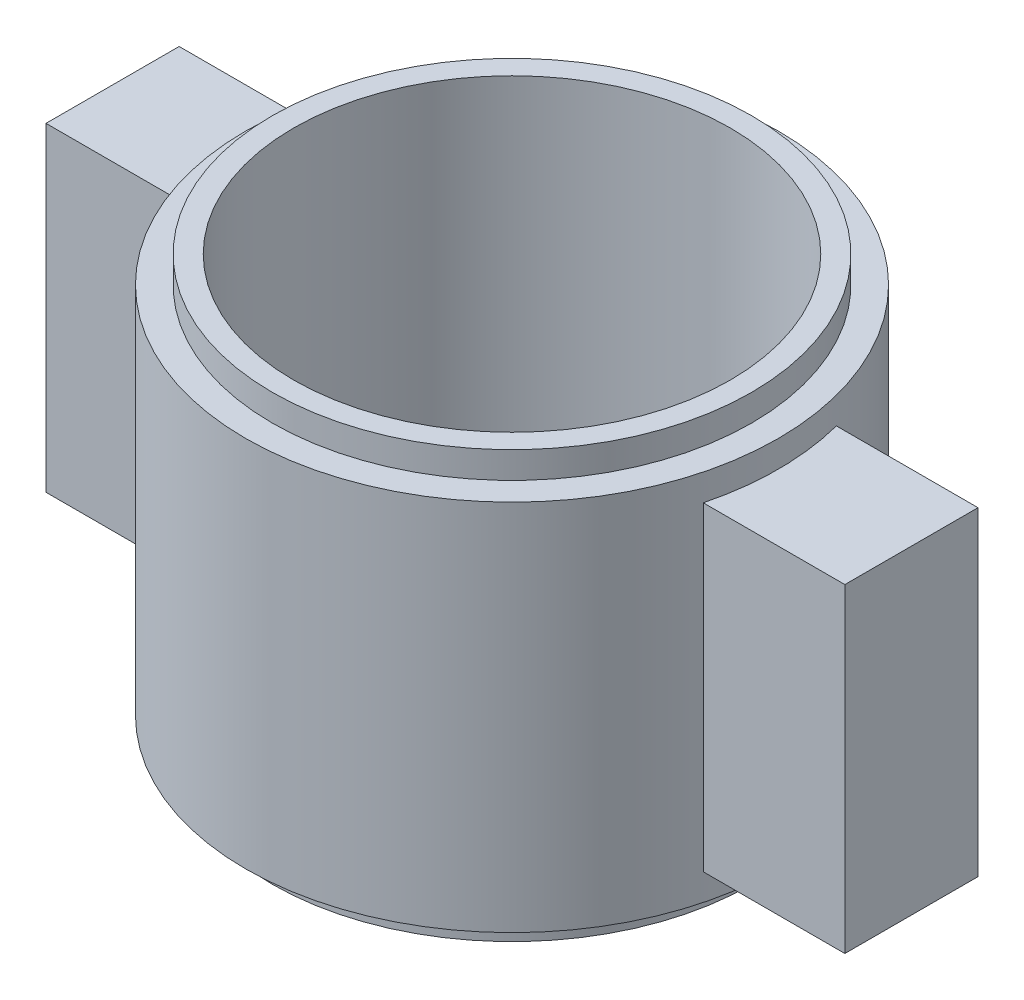
ISO-10303-21;
HEADER;
FILE_DESCRIPTION(('STEP AP214'),'2;1');
FILE_NAME('part.step','',(''),(''),'','','');
FILE_SCHEMA(('AUTOMOTIVE_DESIGN { 1 0 10303 214 1 1 1 1 }'));
ENDSEC;
DATA;
#1=APPLICATION_CONTEXT('core data for automotive mechanical design processes');
#2=APPLICATION_PROTOCOL_DEFINITION('international standard','automotive_design',2000,#1);
#3=PRODUCT_CONTEXT('',#1,'mechanical');
#4=PRODUCT('Part','Part','',(#3));
#5=PRODUCT_RELATED_PRODUCT_CATEGORY('part','',(#4));
#6=PRODUCT_DEFINITION_FORMATION('','',#4);
#7=PRODUCT_DEFINITION_CONTEXT('part definition',#1,'design');
#8=PRODUCT_DEFINITION('design','',#6,#7);
#9=PRODUCT_DEFINITION_SHAPE('','',#8);
#10=(LENGTH_UNIT() NAMED_UNIT(*) SI_UNIT(.MILLI.,.METRE.));
#11=(NAMED_UNIT(*) PLANE_ANGLE_UNIT() SI_UNIT($,.RADIAN.));
#12=(NAMED_UNIT(*) SI_UNIT($,.STERADIAN.) SOLID_ANGLE_UNIT());
#13=UNCERTAINTY_MEASURE_WITH_UNIT(LENGTH_MEASURE(1.E-05),#10,'distance_accuracy_value','');
#14=(GEOMETRIC_REPRESENTATION_CONTEXT(3) GLOBAL_UNCERTAINTY_ASSIGNED_CONTEXT((#13)) GLOBAL_UNIT_ASSIGNED_CONTEXT((#10,
#11,#12)) REPRESENTATION_CONTEXT('',''));
#15=CARTESIAN_POINT('',(0.,0.,0.));
#16=DIRECTION('',(0.,0.,1.));
#17=DIRECTION('',(1.,0.,0.));
#18=AXIS2_PLACEMENT_3D('',#15,#16,#17);
#19=CARTESIAN_POINT('',(0.,0.,0.));
#20=DIRECTION('',(0.,-1.,0.));
#21=DIRECTION('',(0.,0.,-1.));
#22=AXIS2_PLACEMENT_3D('',#19,#20,#21);
#23=CYLINDRICAL_SURFACE('',#22,10.);
#24=DIRECTION('',(0.,-1.,0.));
#25=VECTOR('',#24,1.);
#26=CARTESIAN_POINT('',(9.68245836551854,0.,2.5));
#27=LINE('',#26,#25);
#28=CARTESIAN_POINT('',(9.68245836551854,14.,2.5));
#29=VERTEX_POINT('',#28);
#30=CARTESIAN_POINT('',(9.68245836551854,2.,2.5));
#31=VERTEX_POINT('',#30);
#32=EDGE_CURVE('E11',#29,#31,#27,.T.);
#33=ORIENTED_EDGE('',*,*,#32,.F.);
#34=CARTESIAN_POINT('',(0.,14.,0.));
#35=DIRECTION('',(0.,-1.,0.));
#36=DIRECTION('',(0.,0.,-1.));
#37=AXIS2_PLACEMENT_3D('',#34,#35,#36);
#38=CIRCLE('',#37,10.);
#39=CARTESIAN_POINT('',(9.68245836551854,14.,-2.5));
#40=VERTEX_POINT('',#39);
#41=EDGE_CURVE('E184',#29,#40,#38,.F.);
#42=ORIENTED_EDGE('',*,*,#41,.T.);
#43=DIRECTION('',(0.,-1.,0.));
#44=VECTOR('',#43,1.);
#45=CARTESIAN_POINT('',(9.68245836551854,0.,-2.5));
#46=LINE('',#45,#44);
#47=CARTESIAN_POINT('',(9.68245836551854,2.,-2.5));
#48=VERTEX_POINT('',#47);
#49=EDGE_CURVE('E181',#40,#48,#46,.T.);
#50=ORIENTED_EDGE('',*,*,#49,.T.);
#51=CARTESIAN_POINT('',(0.,2.,0.));
#52=DIRECTION('',(0.,1.,0.));
#53=DIRECTION('',(0.,0.,1.));
#54=AXIS2_PLACEMENT_3D('',#51,#52,#53);
#55=CIRCLE('',#54,10.);
#56=EDGE_CURVE('E47',#48,#31,#55,.F.);
#57=ORIENTED_EDGE('',*,*,#56,.T.);
#58=EDGE_LOOP('',(#33,#42,#50,#57));
#59=FACE_BOUND('',#58,.T.);
#60=CARTESIAN_POINT('',(0.,15.,0.));
#61=DIRECTION('',(0.,-1.,0.));
#62=DIRECTION('',(0.,0.,-1.));
#63=AXIS2_PLACEMENT_3D('',#60,#61,#62);
#64=CIRCLE('',#63,10.);
#65=CARTESIAN_POINT('',(0.,15.,-10.));
#66=VERTEX_POINT('',#65);
#67=EDGE_CURVE('E161',#66,#66,#64,.T.);
#68=ORIENTED_EDGE('',*,*,#67,.T.);
#69=EDGE_LOOP('',(#68));
#70=FACE_BOUND('',#69,.T.);
#71=CARTESIAN_POINT('',(0.,1.,0.));
#72=DIRECTION('',(0.,-1.,0.));
#73=DIRECTION('',(0.,0.,-1.));
#74=AXIS2_PLACEMENT_3D('',#71,#72,#73);
#75=CIRCLE('',#74,10.);
#76=CARTESIAN_POINT('',(0.,1.,-10.));
#77=VERTEX_POINT('',#76);
#78=EDGE_CURVE('E164',#77,#77,#75,.T.);
#79=ORIENTED_EDGE('',*,*,#78,.F.);
#80=EDGE_LOOP('',(#79));
#81=FACE_BOUND('',#80,.T.);
#82=CARTESIAN_POINT('',(0.,14.,0.));
#83=DIRECTION('',(0.,-1.,0.));
#84=DIRECTION('',(0.,0.,-1.));
#85=AXIS2_PLACEMENT_3D('',#82,#83,#84);
#86=CIRCLE('',#85,10.);
#87=CARTESIAN_POINT('',(-9.68245836551854,14.,-2.5));
#88=VERTEX_POINT('',#87);
#89=CARTESIAN_POINT('',(-9.68245836551854,14.,2.5));
#90=VERTEX_POINT('',#89);
#91=EDGE_CURVE('E62',#88,#90,#86,.F.);
#92=ORIENTED_EDGE('',*,*,#91,.T.);
#93=DIRECTION('',(0.,-1.,0.));
#94=VECTOR('',#93,1.);
#95=CARTESIAN_POINT('',(-9.68245836551854,0.,2.5));
#96=LINE('',#95,#94);
#97=CARTESIAN_POINT('',(-9.68245836551854,2.,2.5));
#98=VERTEX_POINT('',#97);
#99=EDGE_CURVE('E179',#90,#98,#96,.T.);
#100=ORIENTED_EDGE('',*,*,#99,.T.);
#101=CARTESIAN_POINT('',(0.,2.,0.));
#102=DIRECTION('',(0.,1.,0.));
#103=DIRECTION('',(0.,0.,1.));
#104=AXIS2_PLACEMENT_3D('',#101,#102,#103);
#105=CIRCLE('',#104,10.);
#106=CARTESIAN_POINT('',(-9.68245836551854,2.,-2.5));
#107=VERTEX_POINT('',#106);
#108=EDGE_CURVE('E176',#98,#107,#105,.F.);
#109=ORIENTED_EDGE('',*,*,#108,.T.);
#110=DIRECTION('',(0.,-1.,0.));
#111=VECTOR('',#110,1.);
#112=CARTESIAN_POINT('',(-9.68245836551854,0.,-2.5));
#113=LINE('',#112,#111);
#114=EDGE_CURVE('E173',#88,#107,#113,.T.);
#115=ORIENTED_EDGE('',*,*,#114,.F.);
#116=EDGE_LOOP('',(#92,#100,#109,#115));
#117=FACE_BOUND('',#116,.T.);
#118=ADVANCED_FACE('F39',(#59,#70,#81,#117),#23,.T.);
#119=CARTESIAN_POINT('',(4.2,0.,0.));
#120=DIRECTION('',(0.,-1.,0.));
#121=DIRECTION('',(0.,0.,-1.));
#122=AXIS2_PLACEMENT_3D('',#119,#120,#121);
#123=PLANE('',#122);
#124=CARTESIAN_POINT('',(0.,0.,0.));
#125=DIRECTION('',(0.,1.,0.));
#126=DIRECTION('',(0.,0.,1.));
#127=AXIS2_PLACEMENT_3D('',#124,#125,#126);
#128=CIRCLE('',#127,8.2);
#129=CARTESIAN_POINT('',(0.,0.,8.2));
#130=VERTEX_POINT('',#129);
#131=EDGE_CURVE('E131',#130,#130,#128,.T.);
#132=ORIENTED_EDGE('',*,*,#131,.T.);
#133=EDGE_LOOP('',(#132));
#134=FACE_BOUND('',#133,.T.);
#135=CARTESIAN_POINT('',(0.,0.,0.));
#136=DIRECTION('',(0.,-1.,0.));
#137=DIRECTION('',(0.,0.,-1.));
#138=AXIS2_PLACEMENT_3D('',#135,#136,#137);
#139=CIRCLE('',#138,9.);
#140=CARTESIAN_POINT('',(0.,0.,-9.));
#141=VERTEX_POINT('',#140);
#142=EDGE_CURVE('E170',#141,#141,#139,.T.);
#143=ORIENTED_EDGE('',*,*,#142,.T.);
#144=EDGE_LOOP('',(#143));
#145=FACE_BOUND('',#144,.T.);
#146=ADVANCED_FACE('F41',(#134,#145),#123,.T.);
#147=CARTESIAN_POINT('',(0.,0.,0.));
#148=DIRECTION('',(0.,-1.,0.));
#149=DIRECTION('',(0.,0.,-1.));
#150=AXIS2_PLACEMENT_3D('',#147,#148,#149);
#151=CYLINDRICAL_SURFACE('',#150,9.);
#152=CARTESIAN_POINT('',(0.,1.,0.));
#153=DIRECTION('',(0.,-1.,0.));
#154=DIRECTION('',(0.,0.,-1.));
#155=AXIS2_PLACEMENT_3D('',#152,#153,#154);
#156=CIRCLE('',#155,9.);
#157=CARTESIAN_POINT('',(0.,1.,-9.));
#158=VERTEX_POINT('',#157);
#159=EDGE_CURVE('E167',#158,#158,#156,.T.);
#160=ORIENTED_EDGE('',*,*,#159,.T.);
#161=EDGE_LOOP('',(#160));
#162=FACE_BOUND('',#161,.T.);
#163=ORIENTED_EDGE('',*,*,#142,.F.);
#164=EDGE_LOOP('',(#163));
#165=FACE_BOUND('',#164,.T.);
#166=ADVANCED_FACE('F206',(#162,#165),#151,.T.);
#167=CARTESIAN_POINT('',(9.,1.,0.));
#168=DIRECTION('',(0.,-1.,0.));
#169=DIRECTION('',(0.,0.,-1.));
#170=AXIS2_PLACEMENT_3D('',#167,#168,#169);
#171=PLANE('',#170);
#172=ORIENTED_EDGE('',*,*,#78,.T.);
#173=EDGE_LOOP('',(#172));
#174=FACE_BOUND('',#173,.T.);
#175=ORIENTED_EDGE('',*,*,#159,.F.);
#176=EDGE_LOOP('',(#175));
#177=FACE_BOUND('',#176,.T.);
#178=ADVANCED_FACE('F212',(#174,#177),#171,.T.);
#179=CARTESIAN_POINT('',(10.,15.,0.));
#180=DIRECTION('',(0.,1.,0.));
#181=DIRECTION('',(0.,0.,1.));
#182=AXIS2_PLACEMENT_3D('',#179,#180,#181);
#183=PLANE('',#182);
#184=CARTESIAN_POINT('',(0.,15.,0.));
#185=DIRECTION('',(0.,-1.,0.));
#186=DIRECTION('',(0.,0.,-1.));
#187=AXIS2_PLACEMENT_3D('',#184,#185,#186);
#188=CIRCLE('',#187,9.);
#189=CARTESIAN_POINT('',(0.,15.,-9.));
#190=VERTEX_POINT('',#189);
#191=EDGE_CURVE('E158',#190,#190,#188,.T.);
#192=ORIENTED_EDGE('',*,*,#191,.T.);
#193=EDGE_LOOP('',(#192));
#194=FACE_BOUND('',#193,.T.);
#195=ORIENTED_EDGE('',*,*,#67,.F.);
#196=EDGE_LOOP('',(#195));
#197=FACE_BOUND('',#196,.T.);
#198=ADVANCED_FACE('F210',(#194,#197),#183,.T.);
#199=CARTESIAN_POINT('',(0.,0.,0.));
#200=DIRECTION('',(0.,-1.,0.));
#201=DIRECTION('',(0.,0.,-1.));
#202=AXIS2_PLACEMENT_3D('',#199,#200,#201);
#203=CYLINDRICAL_SURFACE('',#202,9.);
#204=CARTESIAN_POINT('',(0.,16.,0.));
#205=DIRECTION('',(0.,-1.,0.));
#206=DIRECTION('',(0.,0.,-1.));
#207=AXIS2_PLACEMENT_3D('',#204,#205,#206);
#208=CIRCLE('',#207,9.);
#209=CARTESIAN_POINT('',(0.,16.,-9.));
#210=VERTEX_POINT('',#209);
#211=EDGE_CURVE('E155',#210,#210,#208,.T.);
#212=ORIENTED_EDGE('',*,*,#211,.T.);
#213=EDGE_LOOP('',(#212));
#214=FACE_BOUND('',#213,.T.);
#215=ORIENTED_EDGE('',*,*,#191,.F.);
#216=EDGE_LOOP('',(#215));
#217=FACE_BOUND('',#216,.T.);
#218=ADVANCED_FACE('F236',(#214,#217),#203,.T.);
#219=CARTESIAN_POINT('',(9.,16.,0.));
#220=DIRECTION('',(0.,1.,0.));
#221=DIRECTION('',(0.,0.,1.));
#222=AXIS2_PLACEMENT_3D('',#219,#220,#221);
#223=PLANE('',#222);
#224=CARTESIAN_POINT('',(0.,16.,0.));
#225=DIRECTION('',(0.,1.,0.));
#226=DIRECTION('',(0.,0.,1.));
#227=AXIS2_PLACEMENT_3D('',#224,#225,#226);
#228=CIRCLE('',#227,8.2);
#229=CARTESIAN_POINT('',(0.,16.,8.2));
#230=VERTEX_POINT('',#229);
#231=EDGE_CURVE('E402',#230,#230,#228,.T.);
#232=ORIENTED_EDGE('',*,*,#231,.F.);
#233=EDGE_LOOP('',(#232));
#234=FACE_BOUND('',#233,.T.);
#235=ORIENTED_EDGE('',*,*,#211,.F.);
#236=EDGE_LOOP('',(#235));
#237=FACE_BOUND('',#236,.T.);
#238=ADVANCED_FACE('F243',(#234,#237),#223,.T.);
#239=CARTESIAN_POINT('',(-15.,14.,2.5));
#240=DIRECTION('',(0.,-1.,0.));
#241=DIRECTION('',(0.,0.,-1.));
#242=AXIS2_PLACEMENT_3D('',#239,#240,#241);
#243=PLANE('',#242);
#244=ORIENTED_EDGE('',*,*,#91,.F.);
#245=DIRECTION('',(-1.,0.,0.));
#246=VECTOR('',#245,1.);
#247=CARTESIAN_POINT('',(-15.,14.,-2.5));
#248=LINE('',#247,#246);
#249=CARTESIAN_POINT('',(-15.,14.,-2.5));
#250=VERTEX_POINT('',#249);
#251=EDGE_CURVE('E118',#88,#250,#248,.T.);
#252=ORIENTED_EDGE('',*,*,#251,.T.);
#253=DIRECTION('',(0.,0.,-1.));
#254=VECTOR('',#253,1.);
#255=CARTESIAN_POINT('',(-15.,14.,2.5));
#256=LINE('',#255,#254);
#257=CARTESIAN_POINT('',(-15.,14.,2.5));
#258=VERTEX_POINT('',#257);
#259=EDGE_CURVE('E152',#258,#250,#256,.T.);
#260=ORIENTED_EDGE('',*,*,#259,.F.);
#261=DIRECTION('',(-1.,0.,0.));
#262=VECTOR('',#261,1.);
#263=CARTESIAN_POINT('',(-15.,14.,2.5));
#264=LINE('',#263,#262);
#265=EDGE_CURVE('E136',#90,#258,#264,.T.);
#266=ORIENTED_EDGE('',*,*,#265,.F.);
#267=EDGE_LOOP('',(#244,#252,#260,#266));
#268=FACE_BOUND('',#267,.T.);
#269=ADVANCED_FACE('F251',(#268),#243,.F.);
#270=CARTESIAN_POINT('',(-15.,2.,2.5));
#271=DIRECTION('',(1.,0.,0.));
#272=DIRECTION('',(0.,0.,-1.));
#273=AXIS2_PLACEMENT_3D('',#270,#271,#272);
#274=PLANE('',#273);
#275=DIRECTION('',(0.,-1.,0.));
#276=VECTOR('',#275,1.);
#277=CARTESIAN_POINT('',(-15.,2.,-2.5));
#278=LINE('',#277,#276);
#279=CARTESIAN_POINT('',(-15.,2.,-2.5));
#280=VERTEX_POINT('',#279);
#281=EDGE_CURVE('E146',#250,#280,#278,.T.);
#282=ORIENTED_EDGE('',*,*,#281,.T.);
#283=DIRECTION('',(0.,0.,-1.));
#284=VECTOR('',#283,1.);
#285=CARTESIAN_POINT('',(-15.,2.,2.5));
#286=LINE('',#285,#284);
#287=CARTESIAN_POINT('',(-15.,2.,2.5));
#288=VERTEX_POINT('',#287);
#289=EDGE_CURVE('E144',#288,#280,#286,.T.);
#290=ORIENTED_EDGE('',*,*,#289,.F.);
#291=DIRECTION('',(0.,-1.,0.));
#292=VECTOR('',#291,1.);
#293=CARTESIAN_POINT('',(-15.,2.,2.5));
#294=LINE('',#293,#292);
#295=EDGE_CURVE('E138',#258,#288,#294,.T.);
#296=ORIENTED_EDGE('',*,*,#295,.F.);
#297=ORIENTED_EDGE('',*,*,#259,.T.);
#298=EDGE_LOOP('',(#282,#290,#296,#297));
#299=FACE_BOUND('',#298,.T.);
#300=ADVANCED_FACE('F259',(#299),#274,.F.);
#301=CARTESIAN_POINT('',(-8.,2.,2.5));
#302=DIRECTION('',(0.,1.,0.));
#303=DIRECTION('',(0.,0.,1.));
#304=AXIS2_PLACEMENT_3D('',#301,#302,#303);
#305=PLANE('',#304);
#306=ORIENTED_EDGE('',*,*,#108,.F.);
#307=DIRECTION('',(1.,0.,0.));
#308=VECTOR('',#307,1.);
#309=CARTESIAN_POINT('',(-8.,2.,2.5));
#310=LINE('',#309,#308);
#311=EDGE_CURVE('E141',#288,#98,#310,.T.);
#312=ORIENTED_EDGE('',*,*,#311,.F.);
#313=ORIENTED_EDGE('',*,*,#289,.T.);
#314=DIRECTION('',(1.,0.,0.));
#315=VECTOR('',#314,1.);
#316=CARTESIAN_POINT('',(-8.,2.,-2.5));
#317=LINE('',#316,#315);
#318=EDGE_CURVE('E139',#280,#107,#317,.T.);
#319=ORIENTED_EDGE('',*,*,#318,.T.);
#320=EDGE_LOOP('',(#306,#312,#313,#319));
#321=FACE_BOUND('',#320,.T.);
#322=ADVANCED_FACE('F267',(#321),#305,.F.);
#323=CARTESIAN_POINT('',(0.,0.,2.5));
#324=DIRECTION('',(0.,0.,-1.));
#325=DIRECTION('',(-1.,0.,0.));
#326=AXIS2_PLACEMENT_3D('',#323,#324,#325);
#327=PLANE('',#326);
#328=ORIENTED_EDGE('',*,*,#99,.F.);
#329=ORIENTED_EDGE('',*,*,#265,.T.);
#330=ORIENTED_EDGE('',*,*,#295,.T.);
#331=ORIENTED_EDGE('',*,*,#311,.T.);
#332=EDGE_LOOP('',(#328,#329,#330,#331));
#333=FACE_BOUND('',#332,.T.);
#334=ADVANCED_FACE('F275',(#333),#327,.F.);
#335=CARTESIAN_POINT('',(0.,0.,-2.5));
#336=DIRECTION('',(0.,0.,-1.));
#337=DIRECTION('',(-1.,0.,0.));
#338=AXIS2_PLACEMENT_3D('',#335,#336,#337);
#339=PLANE('',#338);
#340=ORIENTED_EDGE('',*,*,#251,.F.);
#341=ORIENTED_EDGE('',*,*,#114,.T.);
#342=ORIENTED_EDGE('',*,*,#318,.F.);
#343=ORIENTED_EDGE('',*,*,#281,.F.);
#344=EDGE_LOOP('',(#340,#341,#342,#343));
#345=FACE_BOUND('',#344,.T.);
#346=ADVANCED_FACE('F283',(#345),#339,.T.);
#347=CARTESIAN_POINT('',(8.,2.,2.5));
#348=DIRECTION('',(0.,1.,0.));
#349=DIRECTION('',(0.,0.,1.));
#350=AXIS2_PLACEMENT_3D('',#347,#348,#349);
#351=PLANE('',#350);
#352=ORIENTED_EDGE('',*,*,#56,.F.);
#353=DIRECTION('',(1.,0.,0.));
#354=VECTOR('',#353,1.);
#355=CARTESIAN_POINT('',(8.,2.,-2.5));
#356=LINE('',#355,#354);
#357=CARTESIAN_POINT('',(15.,2.,-2.5));
#358=VERTEX_POINT('',#357);
#359=EDGE_CURVE('E54',#48,#358,#356,.T.);
#360=ORIENTED_EDGE('',*,*,#359,.T.);
#361=DIRECTION('',(0.,0.,-1.));
#362=VECTOR('',#361,1.);
#363=CARTESIAN_POINT('',(15.,2.,2.5));
#364=LINE('',#363,#362);
#365=CARTESIAN_POINT('',(15.,2.,2.5));
#366=VERTEX_POINT('',#365);
#367=EDGE_CURVE('E115',#366,#358,#364,.T.);
#368=ORIENTED_EDGE('',*,*,#367,.F.);
#369=DIRECTION('',(1.,0.,0.));
#370=VECTOR('',#369,1.);
#371=CARTESIAN_POINT('',(8.,2.,2.5));
#372=LINE('',#371,#370);
#373=EDGE_CURVE('E102',#31,#366,#372,.T.);
#374=ORIENTED_EDGE('',*,*,#373,.F.);
#375=EDGE_LOOP('',(#352,#360,#368,#374));
#376=FACE_BOUND('',#375,.T.);
#377=ADVANCED_FACE('F116',(#376),#351,.F.);
#378=CARTESIAN_POINT('',(15.,2.,2.5));
#379=DIRECTION('',(-1.,0.,0.));
#380=DIRECTION('',(0.,0.,1.));
#381=AXIS2_PLACEMENT_3D('',#378,#379,#380);
#382=PLANE('',#381);
#383=DIRECTION('',(0.,1.,0.));
#384=VECTOR('',#383,1.);
#385=CARTESIAN_POINT('',(15.,2.,-2.5));
#386=LINE('',#385,#384);
#387=CARTESIAN_POINT('',(15.,14.,-2.5));
#388=VERTEX_POINT('',#387);
#389=EDGE_CURVE('E130',#358,#388,#386,.T.);
#390=ORIENTED_EDGE('',*,*,#389,.T.);
#391=DIRECTION('',(0.,0.,-1.));
#392=VECTOR('',#391,1.);
#393=CARTESIAN_POINT('',(15.,14.,2.5));
#394=LINE('',#393,#392);
#395=CARTESIAN_POINT('',(15.,14.,2.5));
#396=VERTEX_POINT('',#395);
#397=EDGE_CURVE('E119',#396,#388,#394,.T.);
#398=ORIENTED_EDGE('',*,*,#397,.F.);
#399=DIRECTION('',(0.,1.,0.));
#400=VECTOR('',#399,1.);
#401=CARTESIAN_POINT('',(15.,2.,2.5));
#402=LINE('',#401,#400);
#403=EDGE_CURVE('E107',#366,#396,#402,.T.);
#404=ORIENTED_EDGE('',*,*,#403,.F.);
#405=ORIENTED_EDGE('',*,*,#367,.T.);
#406=EDGE_LOOP('',(#390,#398,#404,#405));
#407=FACE_BOUND('',#406,.T.);
#408=ADVANCED_FACE('F121',(#407),#382,.F.);
#409=CARTESIAN_POINT('',(15.,14.,2.5));
#410=DIRECTION('',(0.,-1.,0.));
#411=DIRECTION('',(0.,0.,-1.));
#412=AXIS2_PLACEMENT_3D('',#409,#410,#411);
#413=PLANE('',#412);
#414=ORIENTED_EDGE('',*,*,#41,.F.);
#415=DIRECTION('',(-1.,0.,0.));
#416=VECTOR('',#415,1.);
#417=CARTESIAN_POINT('',(15.,14.,2.5));
#418=LINE('',#417,#416);
#419=EDGE_CURVE('E124',#396,#29,#418,.T.);
#420=ORIENTED_EDGE('',*,*,#419,.F.);
#421=ORIENTED_EDGE('',*,*,#397,.T.);
#422=DIRECTION('',(-1.,0.,0.));
#423=VECTOR('',#422,1.);
#424=CARTESIAN_POINT('',(15.,14.,-2.5));
#425=LINE('',#424,#423);
#426=EDGE_CURVE('E112',#388,#40,#425,.T.);
#427=ORIENTED_EDGE('',*,*,#426,.T.);
#428=EDGE_LOOP('',(#414,#420,#421,#427));
#429=FACE_BOUND('',#428,.T.);
#430=ADVANCED_FACE('F191',(#429),#413,.F.);
#431=CARTESIAN_POINT('',(0.,0.,2.5));
#432=DIRECTION('',(0.,0.,1.));
#433=DIRECTION('',(1.,0.,0.));
#434=AXIS2_PLACEMENT_3D('',#431,#432,#433);
#435=PLANE('',#434);
#436=ORIENTED_EDGE('',*,*,#419,.T.);
#437=ORIENTED_EDGE('',*,*,#32,.T.);
#438=ORIENTED_EDGE('',*,*,#373,.T.);
#439=ORIENTED_EDGE('',*,*,#403,.T.);
#440=EDGE_LOOP('',(#436,#437,#438,#439));
#441=FACE_BOUND('',#440,.T.);
#442=ADVANCED_FACE('F105',(#441),#435,.T.);
#443=CARTESIAN_POINT('',(0.,0.,-2.5));
#444=DIRECTION('',(0.,0.,1.));
#445=DIRECTION('',(1.,0.,0.));
#446=AXIS2_PLACEMENT_3D('',#443,#444,#445);
#447=PLANE('',#446);
#448=ORIENTED_EDGE('',*,*,#49,.F.);
#449=ORIENTED_EDGE('',*,*,#426,.F.);
#450=ORIENTED_EDGE('',*,*,#389,.F.);
#451=ORIENTED_EDGE('',*,*,#359,.F.);
#452=EDGE_LOOP('',(#448,#449,#450,#451));
#453=FACE_BOUND('',#452,.T.);
#454=ADVANCED_FACE('F189',(#453),#447,.F.);
#455=CARTESIAN_POINT('',(0.,0.,0.));
#456=DIRECTION('',(0.,1.,0.));
#457=DIRECTION('',(0.,0.,1.));
#458=AXIS2_PLACEMENT_3D('',#455,#456,#457);
#459=CYLINDRICAL_SURFACE('',#458,8.2);
#460=ORIENTED_EDGE('',*,*,#131,.F.);
#461=EDGE_LOOP('',(#460));
#462=FACE_BOUND('',#461,.T.);
#463=ORIENTED_EDGE('',*,*,#231,.T.);
#464=EDGE_LOOP('',(#463));
#465=FACE_BOUND('',#464,.T.);
#466=ADVANCED_FACE('F323',(#462,#465),#459,.F.);
#467=CLOSED_SHELL('',(#118,#146,#166,#178,#198,#218,#238,#269,#300,#322,#334,#346,#377,#408,
#430,#442,#454,#466));
#468=MANIFOLD_SOLID_BREP('B2',#467);
#469=ADVANCED_BREP_SHAPE_REPRESENTATION('',(#18,#468),#14);
#470=SHAPE_DEFINITION_REPRESENTATION(#9,#469);
ENDSEC;
END-ISO-10303-21;
